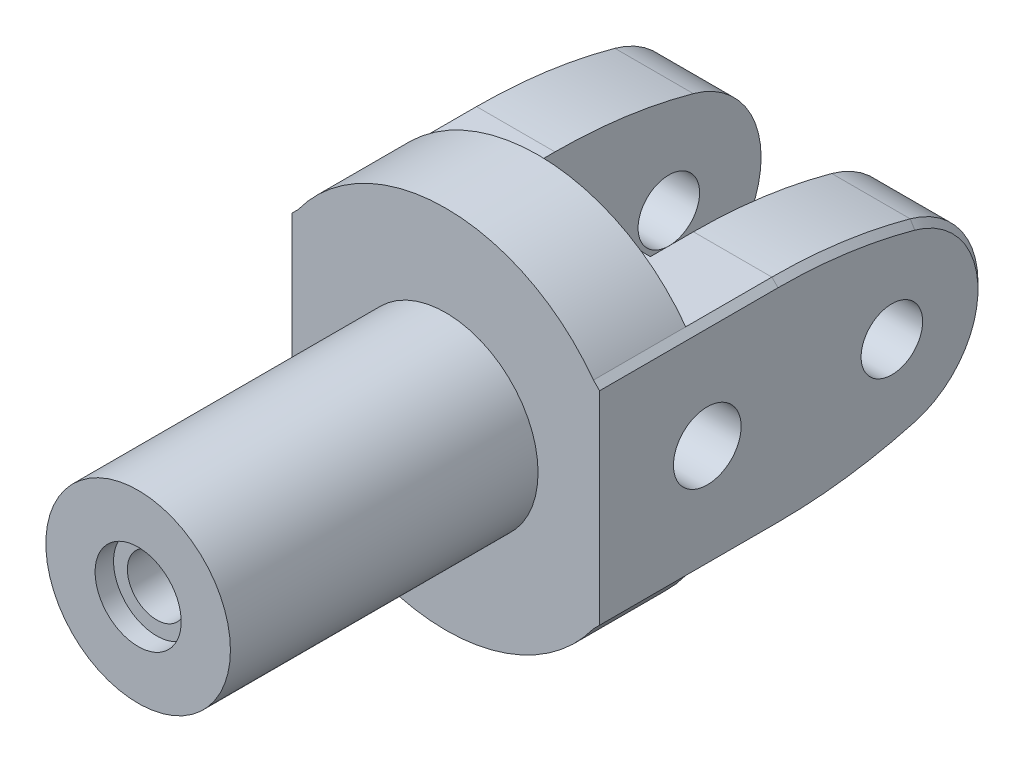
ISO-10303-21;
HEADER;
FILE_DESCRIPTION(('STEP AP214'),'2;1');
FILE_NAME('part.step','',(''),(''),'','','');
FILE_SCHEMA(('AUTOMOTIVE_DESIGN { 1 0 10303 214 1 1 1 1 }'));
ENDSEC;
DATA;
#1=APPLICATION_CONTEXT('core data for automotive mechanical design processes');
#2=APPLICATION_PROTOCOL_DEFINITION('international standard','automotive_design',2000,#1);
#3=PRODUCT_CONTEXT('',#1,'mechanical');
#4=PRODUCT('Part','Part','',(#3));
#5=PRODUCT_RELATED_PRODUCT_CATEGORY('part','',(#4));
#6=PRODUCT_DEFINITION_FORMATION('','',#4);
#7=PRODUCT_DEFINITION_CONTEXT('part definition',#1,'design');
#8=PRODUCT_DEFINITION('design','',#6,#7);
#9=PRODUCT_DEFINITION_SHAPE('','',#8);
#10=(LENGTH_UNIT() NAMED_UNIT(*) SI_UNIT(.MILLI.,.METRE.));
#11=(NAMED_UNIT(*) PLANE_ANGLE_UNIT() SI_UNIT($,.RADIAN.));
#12=(NAMED_UNIT(*) SI_UNIT($,.STERADIAN.) SOLID_ANGLE_UNIT());
#13=UNCERTAINTY_MEASURE_WITH_UNIT(LENGTH_MEASURE(1.E-05),#10,'distance_accuracy_value','');
#14=(GEOMETRIC_REPRESENTATION_CONTEXT(3) GLOBAL_UNCERTAINTY_ASSIGNED_CONTEXT((#13)) GLOBAL_UNIT_ASSIGNED_CONTEXT((#10,
#11,#12)) REPRESENTATION_CONTEXT('',''));
#15=CARTESIAN_POINT('',(0.,0.,0.));
#16=DIRECTION('',(0.,0.,1.));
#17=DIRECTION('',(1.,0.,0.));
#18=AXIS2_PLACEMENT_3D('',#15,#16,#17);
#19=CARTESIAN_POINT('',(0.,0.,0.5));
#20=DIRECTION('',(0.,0.,1.));
#21=DIRECTION('',(1.,0.,0.));
#22=AXIS2_PLACEMENT_3D('',#19,#20,#21);
#23=PLANE('',#22);
#24=DIRECTION('',(-1.,0.,0.));
#25=VECTOR('',#24,1.);
#26=CARTESIAN_POINT('',(5.,-3.50000000000016,0.5));
#27=LINE('',#26,#25);
#28=CARTESIAN_POINT('',(4.8,-3.50000000000016,0.5));
#29=VERTEX_POINT('',#28);
#30=CARTESIAN_POINT('',(-4.8,-3.50000000000016,0.5));
#31=VERTEX_POINT('',#30);
#32=EDGE_CURVE('E305',#29,#31,#27,.T.);
#33=ORIENTED_EDGE('',*,*,#32,.F.);
#34=CARTESIAN_POINT('',(0.,0.,0.5));
#35=DIRECTION('',(0.,0.,1.));
#36=DIRECTION('',(1.,0.,0.));
#37=AXIS2_PLACEMENT_3D('',#34,#35,#36);
#38=CIRCLE('',#37,5.94053869611166);
#39=EDGE_CURVE('E9',#31,#29,#38,.T.);
#40=ORIENTED_EDGE('',*,*,#39,.F.);
#41=EDGE_LOOP('',(#33,#40));
#42=FACE_BOUND('',#41,.T.);
#43=ADVANCED_FACE('F15',(#42),#23,.F.);
#44=CARTESIAN_POINT('',(0.,0.,0.5));
#45=DIRECTION('',(0.,0.,1.));
#46=DIRECTION('',(1.,0.,0.));
#47=AXIS2_PLACEMENT_3D('',#44,#45,#46);
#48=CYLINDRICAL_SURFACE('',#47,5.94053869611166);
#49=CARTESIAN_POINT('',(0.,0.,3.5));
#50=DIRECTION('',(0.,0.,1.));
#51=DIRECTION('',(1.,0.,0.));
#52=AXIS2_PLACEMENT_3D('',#49,#50,#51);
#53=CIRCLE('',#52,5.94053869611166);
#54=CARTESIAN_POINT('',(-4.8,-3.50000000000016,3.5));
#55=VERTEX_POINT('',#54);
#56=CARTESIAN_POINT('',(4.8,-3.50000000000016,3.5));
#57=VERTEX_POINT('',#56);
#58=EDGE_CURVE('E349',#55,#57,#53,.T.);
#59=ORIENTED_EDGE('',*,*,#58,.F.);
#60=DIRECTION('',(0.,0.,-1.));
#61=VECTOR('',#60,1.);
#62=CARTESIAN_POINT('',(-4.8,-3.50000000000016,-2.3));
#63=LINE('',#62,#61);
#64=EDGE_CURVE('E568',#55,#31,#63,.T.);
#65=ORIENTED_EDGE('',*,*,#64,.T.);
#66=ORIENTED_EDGE('',*,*,#39,.T.);
#67=DIRECTION('',(0.,0.,1.));
#68=VECTOR('',#67,1.);
#69=CARTESIAN_POINT('',(4.8,-3.50000000000016,0.5));
#70=LINE('',#69,#68);
#71=EDGE_CURVE('E274',#29,#57,#70,.T.);
#72=ORIENTED_EDGE('',*,*,#71,.T.);
#73=EDGE_LOOP('',(#59,#65,#66,#72));
#74=FACE_BOUND('',#73,.T.);
#75=ADVANCED_FACE('F590',(#74),#48,.T.);
#76=CARTESIAN_POINT('',(0.,0.,0.5));
#77=DIRECTION('',(0.,0.,1.));
#78=DIRECTION('',(1.,0.,0.));
#79=AXIS2_PLACEMENT_3D('',#76,#77,#78);
#80=PLANE('',#79);
#81=DIRECTION('',(-1.,0.,0.));
#82=VECTOR('',#81,1.);
#83=CARTESIAN_POINT('',(5.,3.5,0.5));
#84=LINE('',#83,#82);
#85=CARTESIAN_POINT('',(4.8,3.5,0.5));
#86=VERTEX_POINT('',#85);
#87=CARTESIAN_POINT('',(-4.8,3.5,0.5));
#88=VERTEX_POINT('',#87);
#89=EDGE_CURVE('E439',#86,#88,#84,.T.);
#90=ORIENTED_EDGE('',*,*,#89,.T.);
#91=CARTESIAN_POINT('',(0.,0.,0.5));
#92=DIRECTION('',(0.,0.,1.));
#93=DIRECTION('',(1.,0.,0.));
#94=AXIS2_PLACEMENT_3D('',#91,#92,#93);
#95=CIRCLE('',#94,5.94053869611166);
#96=EDGE_CURVE('E23',#86,#88,#95,.T.);
#97=ORIENTED_EDGE('',*,*,#96,.F.);
#98=EDGE_LOOP('',(#90,#97));
#99=FACE_BOUND('',#98,.T.);
#100=ADVANCED_FACE('F588',(#99),#80,.F.);
#101=CARTESIAN_POINT('',(0.,0.,0.5));
#102=DIRECTION('',(0.,0.,1.));
#103=DIRECTION('',(1.,0.,0.));
#104=AXIS2_PLACEMENT_3D('',#101,#102,#103);
#105=CYLINDRICAL_SURFACE('',#104,5.94053869611166);
#106=CARTESIAN_POINT('',(0.,0.,3.5));
#107=DIRECTION('',(0.,0.,1.));
#108=DIRECTION('',(1.,0.,0.));
#109=AXIS2_PLACEMENT_3D('',#106,#107,#108);
#110=CIRCLE('',#109,5.94053869611166);
#111=CARTESIAN_POINT('',(4.8,3.5,3.5));
#112=VERTEX_POINT('',#111);
#113=CARTESIAN_POINT('',(-4.8,3.5,3.5));
#114=VERTEX_POINT('',#113);
#115=EDGE_CURVE('E373',#112,#114,#110,.T.);
#116=ORIENTED_EDGE('',*,*,#115,.F.);
#117=DIRECTION('',(0.,0.,-1.));
#118=VECTOR('',#117,1.);
#119=CARTESIAN_POINT('',(4.8,3.5,-1.15));
#120=LINE('',#119,#118);
#121=EDGE_CURVE('E545',#112,#86,#120,.T.);
#122=ORIENTED_EDGE('',*,*,#121,.T.);
#123=ORIENTED_EDGE('',*,*,#96,.T.);
#124=DIRECTION('',(0.,0.,1.));
#125=VECTOR('',#124,1.);
#126=CARTESIAN_POINT('',(-4.8,3.5,0.5));
#127=LINE('',#126,#125);
#128=EDGE_CURVE('E553',#88,#114,#127,.T.);
#129=ORIENTED_EDGE('',*,*,#128,.T.);
#130=EDGE_LOOP('',(#116,#122,#123,#129));
#131=FACE_BOUND('',#130,.T.);
#132=ADVANCED_FACE('F577',(#131),#105,.T.);
#133=CARTESIAN_POINT('',(-5.,-3.30000000000016,-2.75));
#134=DIRECTION('',(-0.707106781186547,-0.707106781186548,0.));
#135=DIRECTION('',(-0.707106781186548,0.707106781186547,0.));
#136=AXIS2_PLACEMENT_3D('',#133,#134,#135);
#137=PLANE('',#136);
#138=DIRECTION('',(0.707106781186554,-0.707106781186541,0.));
#139=VECTOR('',#138,1.);
#140=CARTESIAN_POINT('',(-5.,-3.30000000000025,-2.3));
#141=LINE('',#140,#139);
#142=CARTESIAN_POINT('',(-5.,-3.30000000000025,-2.3));
#143=VERTEX_POINT('',#142);
#144=CARTESIAN_POINT('',(-4.8,-3.5,-2.3));
#145=VERTEX_POINT('',#144);
#146=EDGE_CURVE('E565',#143,#145,#141,.T.);
#147=ORIENTED_EDGE('',*,*,#146,.T.);
#148=DIRECTION('',(0.,0.,-1.));
#149=VECTOR('',#148,1.);
#150=CARTESIAN_POINT('',(-4.8,-3.50000000000016,-2.3));
#151=LINE('',#150,#149);
#152=EDGE_CURVE('E311',#31,#145,#151,.T.);
#153=ORIENTED_EDGE('',*,*,#152,.F.);
#154=ORIENTED_EDGE('',*,*,#64,.F.);
#155=DIRECTION('',(0.707106781186548,-0.707106781186547,0.));
#156=VECTOR('',#155,1.);
#157=CARTESIAN_POINT('',(-1.65000000000003,-6.65000000000012,3.5));
#158=LINE('',#157,#156);
#159=CARTESIAN_POINT('',(-5.,-3.30000000000016,3.5));
#160=VERTEX_POINT('',#159);
#161=EDGE_CURVE('E423',#160,#55,#158,.T.);
#162=ORIENTED_EDGE('',*,*,#161,.F.);
#163=DIRECTION('',(0.,0.,1.));
#164=VECTOR('',#163,1.);
#165=CARTESIAN_POINT('',(-5.,-3.30000000000016,3.5));
#166=LINE('',#165,#164);
#167=EDGE_CURVE('E501',#143,#160,#166,.T.);
#168=ORIENTED_EDGE('',*,*,#167,.F.);
#169=EDGE_LOOP('',(#147,#153,#154,#162,#168));
#170=FACE_BOUND('',#169,.T.);
#171=ADVANCED_FACE('F597',(#170),#137,.T.);
#172=CARTESIAN_POINT('',(-4.8,13.4400000000021,-2.3));
#173=DIRECTION('',(1.,0.,0.));
#174=DIRECTION('',(0.,0.,-1.));
#175=AXIS2_PLACEMENT_3D('',#172,#173,#174);
#176=CONICAL_SURFACE('',#175,16.9400000000023,0.785398163397444);
#177=DIRECTION('',(0.707106781186548,-0.681744271100955,-0.187682574633417));
#178=VECTOR('',#177,1.);
#179=CARTESIAN_POINT('',(-5.,-2.69956958393125,-6.74318507890952));
#180=LINE('',#179,#178);
#181=CARTESIAN_POINT('',(-5.,-2.69956958393125,-6.74318507890952));
#182=VERTEX_POINT('',#181);
#183=CARTESIAN_POINT('',(-4.8,-2.89239598278347,-6.79626972740306));
#184=VERTEX_POINT('',#183);
#185=EDGE_CURVE('E562',#182,#184,#180,.T.);
#186=ORIENTED_EDGE('',*,*,#185,.T.);
#187=CARTESIAN_POINT('',(-4.8,13.4400000000021,-2.3));
#188=DIRECTION('',(1.,0.,0.));
#189=DIRECTION('',(0.,0.,-1.));
#190=AXIS2_PLACEMENT_3D('',#187,#188,#189);
#191=CIRCLE('',#190,16.9400000000023);
#192=EDGE_CURVE('E298',#145,#184,#191,.T.);
#193=ORIENTED_EDGE('',*,*,#192,.F.);
#194=ORIENTED_EDGE('',*,*,#146,.F.);
#195=CARTESIAN_POINT('',(-5.,13.4400000000021,-2.3));
#196=DIRECTION('',(-1.,0.,0.));
#197=DIRECTION('',(0.,0.,-1.));
#198=AXIS2_PLACEMENT_3D('',#195,#196,#197);
#199=CIRCLE('',#198,16.7400000000023);
#200=EDGE_CURVE('E497',#182,#143,#199,.T.);
#201=ORIENTED_EDGE('',*,*,#200,.F.);
#202=EDGE_LOOP('',(#186,#193,#194,#201));
#203=FACE_BOUND('',#202,.T.);
#204=ADVANCED_FACE('F613',(#203),#176,.T.);
#205=CARTESIAN_POINT('',(-5.,0.,-6.));
#206=DIRECTION('',(1.,0.,0.));
#207=DIRECTION('',(0.,0.,-1.));
#208=AXIS2_PLACEMENT_3D('',#205,#206,#207);
#209=CONICAL_SURFACE('',#208,2.8,0.785398163397448);
#210=DIRECTION('',(0.707106781186554,0.681744271100951,-0.187682574633406));
#211=VECTOR('',#210,1.);
#212=CARTESIAN_POINT('',(-5.,2.69956958393149,-6.74318507890959));
#213=LINE('',#212,#211);
#214=CARTESIAN_POINT('',(-5.,2.69956958393149,-6.74318507890959));
#215=VERTEX_POINT('',#214);
#216=CARTESIAN_POINT('',(-4.8,2.89239598278372,-6.79626972740313));
#217=VERTEX_POINT('',#216);
#218=EDGE_CURVE('E559',#215,#217,#213,.T.);
#219=ORIENTED_EDGE('',*,*,#218,.T.);
#220=CARTESIAN_POINT('',(-4.8,0.,-6.));
#221=DIRECTION('',(1.,0.,0.));
#222=DIRECTION('',(0.,0.,-1.));
#223=AXIS2_PLACEMENT_3D('',#220,#221,#222);
#224=CIRCLE('',#223,3.);
#225=EDGE_CURVE('E361',#184,#217,#224,.T.);
#226=ORIENTED_EDGE('',*,*,#225,.F.);
#227=ORIENTED_EDGE('',*,*,#185,.F.);
#228=CARTESIAN_POINT('',(-5.,0.,-6.));
#229=DIRECTION('',(-1.,0.,0.));
#230=DIRECTION('',(0.,0.,-1.));
#231=AXIS2_PLACEMENT_3D('',#228,#229,#230);
#232=CIRCLE('',#231,2.8);
#233=EDGE_CURVE('E339',#215,#182,#232,.T.);
#234=ORIENTED_EDGE('',*,*,#233,.F.);
#235=EDGE_LOOP('',(#219,#226,#227,#234));
#236=FACE_BOUND('',#235,.T.);
#237=ADVANCED_FACE('F654',(#236),#209,.T.);
#238=CARTESIAN_POINT('',(-5.,-13.440000000003,-2.3));
#239=DIRECTION('',(1.,0.,0.));
#240=DIRECTION('',(0.,0.,-1.));
#241=AXIS2_PLACEMENT_3D('',#238,#239,#240);
#242=CONICAL_SURFACE('',#241,16.7400000000033,0.785398163397444);
#243=DIRECTION('',(0.707106781186548,0.707106781186547,0.));
#244=VECTOR('',#243,1.);
#245=CARTESIAN_POINT('',(-5.,3.3,-2.3));
#246=LINE('',#245,#244);
#247=CARTESIAN_POINT('',(-5.,3.3,-2.3));
#248=VERTEX_POINT('',#247);
#249=CARTESIAN_POINT('',(-4.8,3.5,-2.3));
#250=VERTEX_POINT('',#249);
#251=EDGE_CURVE('E556',#248,#250,#246,.T.);
#252=ORIENTED_EDGE('',*,*,#251,.T.);
#253=CARTESIAN_POINT('',(-4.8,-13.440000000003,-2.3));
#254=DIRECTION('',(1.,0.,0.));
#255=DIRECTION('',(0.,0.,-1.));
#256=AXIS2_PLACEMENT_3D('',#253,#254,#255);
#257=CIRCLE('',#256,16.9400000000032);
#258=EDGE_CURVE('E385',#217,#250,#257,.T.);
#259=ORIENTED_EDGE('',*,*,#258,.F.);
#260=ORIENTED_EDGE('',*,*,#218,.F.);
#261=CARTESIAN_POINT('',(-5.,-13.440000000003,-2.3));
#262=DIRECTION('',(-1.,0.,0.));
#263=DIRECTION('',(0.,0.,-1.));
#264=AXIS2_PLACEMENT_3D('',#261,#262,#263);
#265=CIRCLE('',#264,16.7400000000032);
#266=EDGE_CURVE('E344',#248,#215,#265,.T.);
#267=ORIENTED_EDGE('',*,*,#266,.F.);
#268=EDGE_LOOP('',(#252,#259,#260,#267));
#269=FACE_BOUND('',#268,.T.);
#270=ADVANCED_FACE('F664',(#269),#242,.T.);
#271=CARTESIAN_POINT('',(-5.,3.3,-2.75));
#272=DIRECTION('',(-0.707106781186547,0.707106781186548,0.));
#273=DIRECTION('',(0.,0.,1.));
#274=AXIS2_PLACEMENT_3D('',#271,#272,#273);
#275=PLANE('',#274);
#276=DIRECTION('',(-0.707106781186548,-0.707106781186547,0.));
#277=VECTOR('',#276,1.);
#278=CARTESIAN_POINT('',(-1.65000000000003,6.65,3.5));
#279=LINE('',#278,#277);
#280=CARTESIAN_POINT('',(-5.,3.3,3.5));
#281=VERTEX_POINT('',#280);
#282=EDGE_CURVE('E490',#114,#281,#279,.T.);
#283=ORIENTED_EDGE('',*,*,#282,.F.);
#284=ORIENTED_EDGE('',*,*,#128,.F.);
#285=DIRECTION('',(0.,0.,1.));
#286=VECTOR('',#285,1.);
#287=CARTESIAN_POINT('',(-4.8,3.5,3.5));
#288=LINE('',#287,#286);
#289=EDGE_CURVE('E418',#250,#88,#288,.T.);
#290=ORIENTED_EDGE('',*,*,#289,.F.);
#291=ORIENTED_EDGE('',*,*,#251,.F.);
#292=DIRECTION('',(0.,0.,-1.));
#293=VECTOR('',#292,1.);
#294=CARTESIAN_POINT('',(-5.,3.3,-2.3));
#295=LINE('',#294,#293);
#296=EDGE_CURVE('E511',#281,#248,#295,.T.);
#297=ORIENTED_EDGE('',*,*,#296,.F.);
#298=EDGE_LOOP('',(#283,#284,#290,#291,#297));
#299=FACE_BOUND('',#298,.T.);
#300=ADVANCED_FACE('F583',(#299),#275,.T.);
#301=CARTESIAN_POINT('',(4.8,-3.50000000000016,1.75));
#302=DIRECTION('',(-0.707106781186548,0.707106781186547,0.));
#303=DIRECTION('',(0.,0.,1.));
#304=AXIS2_PLACEMENT_3D('',#301,#302,#303);
#305=PLANE('',#304);
#306=DIRECTION('',(0.707106781186547,0.707106781186548,0.));
#307=VECTOR('',#306,1.);
#308=CARTESIAN_POINT('',(4.8,-3.50000000000025,-2.3));
#309=LINE('',#308,#307);
#310=CARTESIAN_POINT('',(4.8,-3.5,-2.3));
#311=VERTEX_POINT('',#310);
#312=CARTESIAN_POINT('',(5.,-3.30000000000025,-2.3));
#313=VERTEX_POINT('',#312);
#314=EDGE_CURVE('E263',#311,#313,#309,.T.);
#315=ORIENTED_EDGE('',*,*,#314,.T.);
#316=DIRECTION('',(0.,0.,-1.));
#317=VECTOR('',#316,1.);
#318=CARTESIAN_POINT('',(5.,-3.30000000000016,-2.75));
#319=LINE('',#318,#317);
#320=CARTESIAN_POINT('',(5.,-3.30000000000016,3.5));
#321=VERTEX_POINT('',#320);
#322=EDGE_CURVE('E323',#321,#313,#319,.T.);
#323=ORIENTED_EDGE('',*,*,#322,.F.);
#324=DIRECTION('',(0.707106781186547,0.707106781186548,0.));
#325=VECTOR('',#324,1.);
#326=CARTESIAN_POINT('',(6.65,-1.65000000000011,3.5));
#327=LINE('',#326,#325);
#328=EDGE_CURVE('E345',#57,#321,#327,.T.);
#329=ORIENTED_EDGE('',*,*,#328,.F.);
#330=ORIENTED_EDGE('',*,*,#71,.F.);
#331=DIRECTION('',(0.,0.,1.));
#332=VECTOR('',#331,1.);
#333=CARTESIAN_POINT('',(4.8,-3.50000000000016,1.75));
#334=LINE('',#333,#332);
#335=EDGE_CURVE('E293',#311,#29,#334,.T.);
#336=ORIENTED_EDGE('',*,*,#335,.F.);
#337=EDGE_LOOP('',(#315,#323,#329,#330,#336));
#338=FACE_BOUND('',#337,.T.);
#339=ADVANCED_FACE('F301',(#338),#305,.F.);
#340=CARTESIAN_POINT('',(5.,13.4400000000021,-2.3));
#341=DIRECTION('',(-1.,0.,0.));
#342=DIRECTION('',(0.,0.,1.));
#343=AXIS2_PLACEMENT_3D('',#340,#341,#342);
#344=CONICAL_SURFACE('',#343,16.7400000000023,0.785398163397455);
#345=DIRECTION('',(0.707106781186548,0.681744271100955,0.187682574633418));
#346=VECTOR('',#345,1.);
#347=CARTESIAN_POINT('',(4.8,-2.89239598278347,-6.79626972740306));
#348=LINE('',#347,#346);
#349=CARTESIAN_POINT('',(4.8,-2.89239598278347,-6.79626972740306));
#350=VERTEX_POINT('',#349);
#351=CARTESIAN_POINT('',(5.,-2.69956958393125,-6.74318507890952));
#352=VERTEX_POINT('',#351);
#353=EDGE_CURVE('E275',#350,#352,#348,.T.);
#354=ORIENTED_EDGE('',*,*,#353,.T.);
#355=CARTESIAN_POINT('',(5.,13.4400000000021,-2.3));
#356=DIRECTION('',(1.,0.,0.));
#357=DIRECTION('',(0.,0.,-1.));
#358=AXIS2_PLACEMENT_3D('',#355,#356,#357);
#359=CIRCLE('',#358,16.7400000000023);
#360=EDGE_CURVE('E269',#313,#352,#359,.T.);
#361=ORIENTED_EDGE('',*,*,#360,.F.);
#362=ORIENTED_EDGE('',*,*,#314,.F.);
#363=CARTESIAN_POINT('',(4.8,13.4400000000021,-2.3));
#364=DIRECTION('',(-1.,0.,0.));
#365=DIRECTION('',(0.,0.,-1.));
#366=AXIS2_PLACEMENT_3D('',#363,#364,#365);
#367=CIRCLE('',#366,16.9400000000023);
#368=EDGE_CURVE('E266',#350,#311,#367,.T.);
#369=ORIENTED_EDGE('',*,*,#368,.F.);
#370=EDGE_LOOP('',(#354,#361,#362,#369));
#371=FACE_BOUND('',#370,.T.);
#372=ADVANCED_FACE('F265',(#371),#344,.T.);
#373=CARTESIAN_POINT('',(4.8,0.,-6.));
#374=DIRECTION('',(-1.,0.,0.));
#375=DIRECTION('',(0.,0.,1.));
#376=AXIS2_PLACEMENT_3D('',#373,#374,#375);
#377=CONICAL_SURFACE('',#376,3.,0.785398163397448);
#378=DIRECTION('',(0.707106781186558,-0.681744271100947,0.187682574633406));
#379=VECTOR('',#378,1.);
#380=CARTESIAN_POINT('',(4.8,2.89239598278372,-6.79626972740313));
#381=LINE('',#380,#379);
#382=CARTESIAN_POINT('',(4.8,2.89239598278372,-6.79626972740313));
#383=VERTEX_POINT('',#382);
#384=CARTESIAN_POINT('',(5.,2.6995695839315,-6.7431850789096));
#385=VERTEX_POINT('',#384);
#386=EDGE_CURVE('E388',#383,#385,#381,.T.);
#387=ORIENTED_EDGE('',*,*,#386,.T.);
#388=CARTESIAN_POINT('',(5.,0.,-6.));
#389=DIRECTION('',(1.,0.,0.));
#390=DIRECTION('',(0.,0.,-1.));
#391=AXIS2_PLACEMENT_3D('',#388,#389,#390);
#392=CIRCLE('',#391,2.8);
#393=EDGE_CURVE('E454',#352,#385,#392,.T.);
#394=ORIENTED_EDGE('',*,*,#393,.F.);
#395=ORIENTED_EDGE('',*,*,#353,.F.);
#396=CARTESIAN_POINT('',(4.8,0.,-6.));
#397=DIRECTION('',(-1.,0.,0.));
#398=DIRECTION('',(0.,0.,-1.));
#399=AXIS2_PLACEMENT_3D('',#396,#397,#398);
#400=CIRCLE('',#399,3.);
#401=EDGE_CURVE('E431',#383,#350,#400,.T.);
#402=ORIENTED_EDGE('',*,*,#401,.F.);
#403=EDGE_LOOP('',(#387,#394,#395,#402));
#404=FACE_BOUND('',#403,.T.);
#405=ADVANCED_FACE('F638',(#404),#377,.T.);
#406=CARTESIAN_POINT('',(4.8,-13.440000000003,-2.3));
#407=DIRECTION('',(-1.,0.,0.));
#408=DIRECTION('',(0.,0.,1.));
#409=AXIS2_PLACEMENT_3D('',#406,#407,#408);
#410=CONICAL_SURFACE('',#409,16.9400000000032,0.785398163397446);
#411=DIRECTION('',(0.707106781186547,-0.707106781186548,0.));
#412=VECTOR('',#411,1.);
#413=CARTESIAN_POINT('',(4.8,3.5,-2.3));
#414=LINE('',#413,#412);
#415=CARTESIAN_POINT('',(4.8,3.5,-2.3));
#416=VERTEX_POINT('',#415);
#417=CARTESIAN_POINT('',(5.,3.3,-2.3));
#418=VERTEX_POINT('',#417);
#419=EDGE_CURVE('E542',#416,#418,#414,.T.);
#420=ORIENTED_EDGE('',*,*,#419,.T.);
#421=CARTESIAN_POINT('',(5.,-13.440000000003,-2.3));
#422=DIRECTION('',(1.,0.,0.));
#423=DIRECTION('',(0.,0.,-1.));
#424=AXIS2_PLACEMENT_3D('',#421,#422,#423);
#425=CIRCLE('',#424,16.7400000000033);
#426=EDGE_CURVE('E449',#385,#418,#425,.T.);
#427=ORIENTED_EDGE('',*,*,#426,.F.);
#428=ORIENTED_EDGE('',*,*,#386,.F.);
#429=CARTESIAN_POINT('',(4.8,-13.440000000003,-2.3));
#430=DIRECTION('',(-1.,0.,0.));
#431=DIRECTION('',(0.,0.,-1.));
#432=AXIS2_PLACEMENT_3D('',#429,#430,#431);
#433=CIRCLE('',#432,16.9400000000032);
#434=EDGE_CURVE('E448',#416,#383,#433,.T.);
#435=ORIENTED_EDGE('',*,*,#434,.F.);
#436=EDGE_LOOP('',(#420,#427,#428,#435));
#437=FACE_BOUND('',#436,.T.);
#438=ADVANCED_FACE('F713',(#437),#410,.T.);
#439=CARTESIAN_POINT('',(4.8,3.5,-1.15));
#440=DIRECTION('',(-0.707106781186548,-0.707106781186547,0.));
#441=DIRECTION('',(-0.707106781186547,0.707106781186548,0.));
#442=AXIS2_PLACEMENT_3D('',#439,#440,#441);
#443=PLANE('',#442);
#444=DIRECTION('',(-0.707106781186547,0.707106781186548,0.));
#445=VECTOR('',#444,1.);
#446=CARTESIAN_POINT('',(6.65,1.64999999999995,3.5));
#447=LINE('',#446,#445);
#448=CARTESIAN_POINT('',(5.,3.3,3.5));
#449=VERTEX_POINT('',#448);
#450=EDGE_CURVE('E369',#449,#112,#447,.T.);
#451=ORIENTED_EDGE('',*,*,#450,.F.);
#452=DIRECTION('',(0.,0.,1.));
#453=VECTOR('',#452,1.);
#454=CARTESIAN_POINT('',(5.,3.3,-2.75));
#455=LINE('',#454,#453);
#456=EDGE_CURVE('E453',#418,#449,#455,.T.);
#457=ORIENTED_EDGE('',*,*,#456,.F.);
#458=ORIENTED_EDGE('',*,*,#419,.F.);
#459=DIRECTION('',(0.,0.,-1.));
#460=VECTOR('',#459,1.);
#461=CARTESIAN_POINT('',(4.8,3.5,-1.15));
#462=LINE('',#461,#460);
#463=EDGE_CURVE('E443',#86,#416,#462,.T.);
#464=ORIENTED_EDGE('',*,*,#463,.F.);
#465=ORIENTED_EDGE('',*,*,#121,.F.);
#466=EDGE_LOOP('',(#451,#457,#458,#464,#465));
#467=FACE_BOUND('',#466,.T.);
#468=ADVANCED_FACE('F711',(#467),#443,.F.);
#469=CARTESIAN_POINT('',(0.,0.,13.5));
#470=DIRECTION('',(0.,0.,-1.));
#471=DIRECTION('',(-1.,0.,0.));
#472=AXIS2_PLACEMENT_3D('',#469,#470,#471);
#473=CYLINDRICAL_SURFACE('',#472,1.4);
#474=CARTESIAN_POINT('',(0.,0.,13.5));
#475=DIRECTION('',(0.,0.,-1.));
#476=DIRECTION('',(-1.,0.,0.));
#477=AXIS2_PLACEMENT_3D('',#474,#475,#476);
#478=CIRCLE('',#477,1.4);
#479=CARTESIAN_POINT('',(-1.4,0.,13.5));
#480=VERTEX_POINT('',#479);
#481=EDGE_CURVE('E353',#480,#480,#478,.T.);
#482=ORIENTED_EDGE('',*,*,#481,.F.);
#483=EDGE_LOOP('',(#482));
#484=FACE_BOUND('',#483,.T.);
#485=CARTESIAN_POINT('',(0.,0.,12.9));
#486=DIRECTION('',(0.,0.,-1.));
#487=DIRECTION('',(-1.,0.,0.));
#488=AXIS2_PLACEMENT_3D('',#485,#486,#487);
#489=CIRCLE('',#488,1.4);
#490=CARTESIAN_POINT('',(-1.4,0.,12.9));
#491=VERTEX_POINT('',#490);
#492=EDGE_CURVE('E33',#491,#491,#489,.T.);
#493=ORIENTED_EDGE('',*,*,#492,.T.);
#494=EDGE_LOOP('',(#493));
#495=FACE_BOUND('',#494,.T.);
#496=ADVANCED_FACE('F707',(#484,#495),#473,.F.);
#497=CARTESIAN_POINT('',(1.4,0.,12.9));
#498=DIRECTION('',(0.,0.,1.));
#499=DIRECTION('',(1.,0.,0.));
#500=AXIS2_PLACEMENT_3D('',#497,#498,#499);
#501=PLANE('',#500);
#502=ORIENTED_EDGE('',*,*,#492,.F.);
#503=EDGE_LOOP('',(#502));
#504=FACE_BOUND('',#503,.T.);
#505=CARTESIAN_POINT('',(0.,0.,12.9));
#506=DIRECTION('',(0.,0.,-1.));
#507=DIRECTION('',(-1.,0.,0.));
#508=AXIS2_PLACEMENT_3D('',#505,#506,#507);
#509=CIRCLE('',#508,0.95);
#510=CARTESIAN_POINT('',(-0.95,0.,12.9));
#511=VERTEX_POINT('',#510);
#512=EDGE_CURVE('E40',#511,#511,#509,.T.);
#513=ORIENTED_EDGE('',*,*,#512,.T.);
#514=EDGE_LOOP('',(#513));
#515=FACE_BOUND('',#514,.T.);
#516=ADVANCED_FACE('F703',(#504,#515),#501,.T.);
#517=CARTESIAN_POINT('',(0.,0.,13.5));
#518=DIRECTION('',(0.,0.,-1.));
#519=DIRECTION('',(-1.,0.,0.));
#520=AXIS2_PLACEMENT_3D('',#517,#518,#519);
#521=CYLINDRICAL_SURFACE('',#520,0.95);
#522=ORIENTED_EDGE('',*,*,#512,.F.);
#523=EDGE_LOOP('',(#522));
#524=FACE_BOUND('',#523,.T.);
#525=CARTESIAN_POINT('',(0.,0.,5.5));
#526=DIRECTION('',(0.,0.,-1.));
#527=DIRECTION('',(-1.,0.,0.));
#528=AXIS2_PLACEMENT_3D('',#525,#526,#527);
#529=CIRCLE('',#528,0.95);
#530=CARTESIAN_POINT('',(-0.95,0.,5.5));
#531=VERTEX_POINT('',#530);
#532=EDGE_CURVE('E356',#531,#531,#529,.T.);
#533=ORIENTED_EDGE('',*,*,#532,.T.);
#534=EDGE_LOOP('',(#533));
#535=FACE_BOUND('',#534,.T.);
#536=ADVANCED_FACE('F700',(#524,#535),#521,.F.);
#537=CARTESIAN_POINT('',(0.,0.,5.5));
#538=DIRECTION('',(0.,0.,1.));
#539=DIRECTION('',(1.,0.,0.));
#540=AXIS2_PLACEMENT_3D('',#537,#538,#539);
#541=CONICAL_SURFACE('',#540,0.95,1.02974425867665);
#542=ORIENTED_EDGE('',*,*,#532,.F.);
#543=EDGE_LOOP('',(#542));
#544=FACE_BOUND('',#543,.T.);
#545=CARTESIAN_POINT('',(0.,0.,4.92918241192382));
#546=VERTEX_POINT('',#545);
#547=VERTEX_LOOP('',#546);
#548=FACE_BOUND('',#547,.T.);
#549=ADVANCED_FACE('F698',(#544,#548),#541,.F.);
#550=CARTESIAN_POINT('',(0.,0.,13.5));
#551=DIRECTION('',(0.,0.,1.));
#552=DIRECTION('',(1.,0.,0.));
#553=AXIS2_PLACEMENT_3D('',#550,#551,#552);
#554=PLANE('',#553);
#555=CARTESIAN_POINT('',(0.,0.,13.5));
#556=DIRECTION('',(0.,0.,1.));
#557=DIRECTION('',(1.,0.,0.));
#558=AXIS2_PLACEMENT_3D('',#555,#556,#557);
#559=CIRCLE('',#558,3.);
#560=CARTESIAN_POINT('',(3.,0.,13.5));
#561=VERTEX_POINT('',#560);
#562=EDGE_CURVE('E357',#561,#561,#559,.T.);
#563=ORIENTED_EDGE('',*,*,#562,.T.);
#564=EDGE_LOOP('',(#563));
#565=FACE_BOUND('',#564,.T.);
#566=ORIENTED_EDGE('',*,*,#481,.T.);
#567=EDGE_LOOP('',(#566));
#568=FACE_BOUND('',#567,.T.);
#569=ADVANCED_FACE('F694',(#565,#568),#554,.T.);
#570=CARTESIAN_POINT('',(0.,0.,13.5));
#571=DIRECTION('',(0.,0.,-1.));
#572=DIRECTION('',(-1.,0.,0.));
#573=AXIS2_PLACEMENT_3D('',#570,#571,#572);
#574=CYLINDRICAL_SURFACE('',#573,3.);
#575=CARTESIAN_POINT('',(0.,0.,3.5));
#576=DIRECTION('',(0.,0.,1.));
#577=DIRECTION('',(1.,0.,0.));
#578=AXIS2_PLACEMENT_3D('',#575,#576,#577);
#579=CIRCLE('',#578,3.);
#580=CARTESIAN_POINT('',(3.,0.,3.5));
#581=VERTEX_POINT('',#580);
#582=EDGE_CURVE('E427',#581,#581,#579,.T.);
#583=ORIENTED_EDGE('',*,*,#582,.T.);
#584=EDGE_LOOP('',(#583));
#585=FACE_BOUND('',#584,.T.);
#586=ORIENTED_EDGE('',*,*,#562,.F.);
#587=EDGE_LOOP('',(#586));
#588=FACE_BOUND('',#587,.T.);
#589=ADVANCED_FACE('F690',(#585,#588),#574,.T.);
#590=CARTESIAN_POINT('',(-2.25,0.5,-2.3));
#591=DIRECTION('',(0.,-0.422618261740699,0.90630778703665));
#592=DIRECTION('',(-1.,0.,0.));
#593=AXIS2_PLACEMENT_3D('',#590,#591,#592);
#594=PLANE('',#593);
#595=DIRECTION('',(0.,-0.90630778703665,-0.422618261740699));
#596=VECTOR('',#595,1.);
#597=CARTESIAN_POINT('',(-2.25,0.5,-2.3));
#598=LINE('',#597,#596);
#599=CARTESIAN_POINT('',(-2.25,3.5,-0.901077025535004));
#600=VERTEX_POINT('',#599);
#601=CARTESIAN_POINT('',(-2.25,0.5,-2.3));
#602=VERTEX_POINT('',#601);
#603=EDGE_CURVE('E403',#600,#602,#598,.T.);
#604=ORIENTED_EDGE('',*,*,#603,.F.);
#605=DIRECTION('',(-1.,0.,0.));
#606=VECTOR('',#605,1.);
#607=CARTESIAN_POINT('',(5.,3.5,-0.901077025535004));
#608=LINE('',#607,#606);
#609=CARTESIAN_POINT('',(2.25,3.5,-0.901077025535004));
#610=VERTEX_POINT('',#609);
#611=EDGE_CURVE('E419',#610,#600,#608,.T.);
#612=ORIENTED_EDGE('',*,*,#611,.F.);
#613=DIRECTION('',(0.,0.90630778703665,0.422618261740699));
#614=VECTOR('',#613,1.);
#615=CARTESIAN_POINT('',(2.25,-0.0830569021234106,-2.57188389860027));
#616=LINE('',#615,#614);
#617=CARTESIAN_POINT('',(2.25,0.5,-2.3));
#618=VERTEX_POINT('',#617);
#619=EDGE_CURVE('E413',#618,#610,#616,.T.);
#620=ORIENTED_EDGE('',*,*,#619,.F.);
#621=DIRECTION('',(1.,0.,0.));
#622=VECTOR('',#621,1.);
#623=CARTESIAN_POINT('',(-2.25,0.5,-2.3));
#624=LINE('',#623,#622);
#625=EDGE_CURVE('E479',#602,#618,#624,.T.);
#626=ORIENTED_EDGE('',*,*,#625,.F.);
#627=EDGE_LOOP('',(#604,#612,#620,#626));
#628=FACE_BOUND('',#627,.T.);
#629=ADVANCED_FACE('F687',(#628),#594,.F.);
#630=CARTESIAN_POINT('',(5.,-3.50000000000016,-0.901077025534929));
#631=DIRECTION('',(0.,0.422618261740699,0.90630778703665));
#632=DIRECTION('',(1.,0.,0.));
#633=AXIS2_PLACEMENT_3D('',#630,#631,#632);
#634=PLANE('',#633);
#635=DIRECTION('',(0.,-0.90630778703665,0.422618261740699));
#636=VECTOR('',#635,1.);
#637=CARTESIAN_POINT('',(-2.25,-3.50000000000016,-0.901077025534929));
#638=LINE('',#637,#636);
#639=CARTESIAN_POINT('',(-2.25,-0.5,-2.3));
#640=VERTEX_POINT('',#639);
#641=CARTESIAN_POINT('',(-2.25,-3.50000000000016,-0.901077025534929));
#642=VERTEX_POINT('',#641);
#643=EDGE_CURVE('E407',#640,#642,#638,.T.);
#644=ORIENTED_EDGE('',*,*,#643,.F.);
#645=DIRECTION('',(-1.,0.,0.));
#646=VECTOR('',#645,1.);
#647=CARTESIAN_POINT('',(-2.25,-0.5,-2.3));
#648=LINE('',#647,#646);
#649=CARTESIAN_POINT('',(2.25,-0.5,-2.3));
#650=VERTEX_POINT('',#649);
#651=EDGE_CURVE('E521',#650,#640,#648,.T.);
#652=ORIENTED_EDGE('',*,*,#651,.F.);
#653=DIRECTION('',(0.,0.90630778703665,-0.422618261740699));
#654=VECTOR('',#653,1.);
#655=CARTESIAN_POINT('',(2.25,0.0830569021234058,-2.57188389860027));
#656=LINE('',#655,#654);
#657=CARTESIAN_POINT('',(2.25,-3.50000000000016,-0.901077025534929));
#658=VERTEX_POINT('',#657);
#659=EDGE_CURVE('E406',#658,#650,#656,.T.);
#660=ORIENTED_EDGE('',*,*,#659,.F.);
#661=DIRECTION('',(1.,0.,0.));
#662=VECTOR('',#661,1.);
#663=CARTESIAN_POINT('',(5.,-3.50000000000016,-0.901077025534929));
#664=LINE('',#663,#662);
#665=EDGE_CURVE('E329',#642,#658,#664,.T.);
#666=ORIENTED_EDGE('',*,*,#665,.F.);
#667=EDGE_LOOP('',(#644,#652,#660,#666));
#668=FACE_BOUND('',#667,.T.);
#669=ADVANCED_FACE('F626',(#668),#634,.F.);
#670=CARTESIAN_POINT('',(2.25,0.,-2.75));
#671=DIRECTION('',(1.,0.,0.));
#672=DIRECTION('',(0.,1.,0.));
#673=AXIS2_PLACEMENT_3D('',#670,#671,#672);
#674=PLANE('',#673);
#675=CARTESIAN_POINT('',(2.25,13.4400000000021,-2.3));
#676=DIRECTION('',(1.,0.,0.));
#677=DIRECTION('',(0.,0.,-1.));
#678=AXIS2_PLACEMENT_3D('',#675,#676,#677);
#679=CIRCLE('',#678,16.9400000000023);
#680=CARTESIAN_POINT('',(2.25,-3.5,-2.3));
#681=VERTEX_POINT('',#680);
#682=CARTESIAN_POINT('',(2.25,-2.89239598278347,-6.79626972740306));
#683=VERTEX_POINT('',#682);
#684=EDGE_CURVE('E287',#681,#683,#679,.T.);
#685=ORIENTED_EDGE('',*,*,#684,.F.);
#686=DIRECTION('',(0.,0.,-1.));
#687=VECTOR('',#686,1.);
#688=CARTESIAN_POINT('',(2.25,-3.50000000000016,-2.75));
#689=LINE('',#688,#687);
#690=EDGE_CURVE('E296',#658,#681,#689,.T.);
#691=ORIENTED_EDGE('',*,*,#690,.F.);
#692=ORIENTED_EDGE('',*,*,#659,.T.);
#693=DIRECTION('',(0.,1.,0.));
#694=VECTOR('',#693,1.);
#695=CARTESIAN_POINT('',(2.25,1.74999999999997,-2.3));
#696=LINE('',#695,#694);
#697=EDGE_CURVE('E343',#650,#618,#696,.T.);
#698=ORIENTED_EDGE('',*,*,#697,.T.);
#699=ORIENTED_EDGE('',*,*,#619,.T.);
#700=DIRECTION('',(0.,0.,1.));
#701=VECTOR('',#700,1.);
#702=CARTESIAN_POINT('',(2.25,3.5,-2.75));
#703=LINE('',#702,#701);
#704=CARTESIAN_POINT('',(2.25,3.5,-2.3));
#705=VERTEX_POINT('',#704);
#706=EDGE_CURVE('E466',#705,#610,#703,.T.);
#707=ORIENTED_EDGE('',*,*,#706,.F.);
#708=CARTESIAN_POINT('',(2.25,-13.440000000003,-2.3));
#709=DIRECTION('',(-1.,0.,0.));
#710=DIRECTION('',(0.,0.,-1.));
#711=AXIS2_PLACEMENT_3D('',#708,#709,#710);
#712=CIRCLE('',#711,16.9400000000032);
#713=CARTESIAN_POINT('',(2.25,2.89239598278372,-6.79626972740313));
#714=VERTEX_POINT('',#713);
#715=EDGE_CURVE('E444',#705,#714,#712,.T.);
#716=ORIENTED_EDGE('',*,*,#715,.T.);
#717=CARTESIAN_POINT('',(2.25,0.,-6.));
#718=DIRECTION('',(-1.,0.,0.));
#719=DIRECTION('',(0.,0.,-1.));
#720=AXIS2_PLACEMENT_3D('',#717,#718,#719);
#721=CIRCLE('',#720,3.);
#722=EDGE_CURVE('E435',#714,#683,#721,.T.);
#723=ORIENTED_EDGE('',*,*,#722,.T.);
#724=EDGE_LOOP('',(#685,#691,#692,#698,#699,#707,#716,#723));
#725=FACE_BOUND('',#724,.T.);
#726=CARTESIAN_POINT('',(2.25,0.,-6.));
#727=DIRECTION('',(1.,0.,0.));
#728=DIRECTION('',(0.,0.,-1.));
#729=AXIS2_PLACEMENT_3D('',#726,#727,#728);
#730=CIRCLE('',#729,1.);
#731=CARTESIAN_POINT('',(2.25,0.,-7.));
#732=VERTEX_POINT('',#731);
#733=EDGE_CURVE('E324',#732,#732,#730,.T.);
#734=ORIENTED_EDGE('',*,*,#733,.T.);
#735=EDGE_LOOP('',(#734));
#736=FACE_BOUND('',#735,.T.);
#737=ADVANCED_FACE('F630',(#725,#736),#674,.F.);
#738=CARTESIAN_POINT('',(-2.25,0.,-2.75));
#739=DIRECTION('',(1.,0.,0.));
#740=DIRECTION('',(0.,1.,0.));
#741=AXIS2_PLACEMENT_3D('',#738,#739,#740);
#742=PLANE('',#741);
#743=DIRECTION('',(0.,1.,0.));
#744=VECTOR('',#743,1.);
#745=CARTESIAN_POINT('',(-2.25,1.74999999999997,-2.3));
#746=LINE('',#745,#744);
#747=EDGE_CURVE('E525',#640,#602,#746,.T.);
#748=ORIENTED_EDGE('',*,*,#747,.F.);
#749=ORIENTED_EDGE('',*,*,#643,.T.);
#750=DIRECTION('',(0.,0.,1.));
#751=VECTOR('',#750,1.);
#752=CARTESIAN_POINT('',(-2.25,-3.50000000000016,1.75));
#753=LINE('',#752,#751);
#754=CARTESIAN_POINT('',(-2.25,-3.5,-2.3));
#755=VERTEX_POINT('',#754);
#756=EDGE_CURVE('E332',#755,#642,#753,.T.);
#757=ORIENTED_EDGE('',*,*,#756,.F.);
#758=CARTESIAN_POINT('',(-2.25,13.4400000000021,-2.3));
#759=DIRECTION('',(1.,0.,0.));
#760=DIRECTION('',(0.,0.,-1.));
#761=AXIS2_PLACEMENT_3D('',#758,#759,#760);
#762=CIRCLE('',#761,16.9400000000023);
#763=CARTESIAN_POINT('',(-2.25,-2.89239598278347,-6.79626972740306));
#764=VERTEX_POINT('',#763);
#765=EDGE_CURVE('E328',#755,#764,#762,.T.);
#766=ORIENTED_EDGE('',*,*,#765,.T.);
#767=CARTESIAN_POINT('',(-2.25,0.,-6.));
#768=DIRECTION('',(-1.,0.,0.));
#769=DIRECTION('',(0.,0.,-1.));
#770=AXIS2_PLACEMENT_3D('',#767,#768,#769);
#771=CIRCLE('',#770,3.);
#772=CARTESIAN_POINT('',(-2.25,2.89239598278372,-6.79626972740313));
#773=VERTEX_POINT('',#772);
#774=EDGE_CURVE('E379',#773,#764,#771,.T.);
#775=ORIENTED_EDGE('',*,*,#774,.F.);
#776=CARTESIAN_POINT('',(-2.25,-13.440000000003,-2.3));
#777=DIRECTION('',(-1.,0.,0.));
#778=DIRECTION('',(0.,0.,-1.));
#779=AXIS2_PLACEMENT_3D('',#776,#777,#778);
#780=CIRCLE('',#779,16.9400000000032);
#781=CARTESIAN_POINT('',(-2.25,3.5,-2.3));
#782=VERTEX_POINT('',#781);
#783=EDGE_CURVE('E396',#782,#773,#780,.T.);
#784=ORIENTED_EDGE('',*,*,#783,.F.);
#785=DIRECTION('',(0.,0.,-1.));
#786=VECTOR('',#785,1.);
#787=CARTESIAN_POINT('',(-2.25,3.5,-1.15));
#788=LINE('',#787,#786);
#789=EDGE_CURVE('E415',#600,#782,#788,.T.);
#790=ORIENTED_EDGE('',*,*,#789,.F.);
#791=ORIENTED_EDGE('',*,*,#603,.T.);
#792=EDGE_LOOP('',(#748,#749,#757,#766,#775,#784,#790,#791));
#793=FACE_BOUND('',#792,.T.);
#794=CARTESIAN_POINT('',(-2.25,0.,-6.));
#795=DIRECTION('',(1.,0.,0.));
#796=DIRECTION('',(0.,0.,-1.));
#797=AXIS2_PLACEMENT_3D('',#794,#795,#796);
#798=CIRCLE('',#797,1.);
#799=CARTESIAN_POINT('',(-2.25,0.,-7.));
#800=VERTEX_POINT('',#799);
#801=EDGE_CURVE('E402',#800,#800,#798,.T.);
#802=ORIENTED_EDGE('',*,*,#801,.F.);
#803=EDGE_LOOP('',(#802));
#804=FACE_BOUND('',#803,.T.);
#805=ADVANCED_FACE('F622',(#793,#804),#742,.T.);
#806=CARTESIAN_POINT('',(-2.25,1.74999999999997,-2.3));
#807=DIRECTION('',(0.,0.,-1.));
#808=DIRECTION('',(0.,-1.,0.));
#809=AXIS2_PLACEMENT_3D('',#806,#807,#808);
#810=PLANE('',#809);
#811=ORIENTED_EDGE('',*,*,#697,.F.);
#812=ORIENTED_EDGE('',*,*,#651,.T.);
#813=ORIENTED_EDGE('',*,*,#747,.T.);
#814=ORIENTED_EDGE('',*,*,#625,.T.);
#815=EDGE_LOOP('',(#811,#812,#813,#814));
#816=FACE_BOUND('',#815,.T.);
#817=ADVANCED_FACE('F677',(#816),#810,.T.);
#818=CARTESIAN_POINT('',(-5.,0.,-2.75));
#819=DIRECTION('',(1.,0.,0.));
#820=DIRECTION('',(0.,1.,0.));
#821=AXIS2_PLACEMENT_3D('',#818,#819,#820);
#822=PLANE('',#821);
#823=CARTESIAN_POINT('',(-5.,0.,-6.));
#824=DIRECTION('',(1.,0.,0.));
#825=DIRECTION('',(0.,0.,-1.));
#826=AXIS2_PLACEMENT_3D('',#823,#824,#825);
#827=CIRCLE('',#826,1.);
#828=CARTESIAN_POINT('',(-5.,0.,-7.));
#829=VERTEX_POINT('',#828);
#830=EDGE_CURVE('E399',#829,#829,#827,.T.);
#831=ORIENTED_EDGE('',*,*,#830,.T.);
#832=EDGE_LOOP('',(#831));
#833=FACE_BOUND('',#832,.T.);
#834=CARTESIAN_POINT('',(-5.,0.,0.));
#835=DIRECTION('',(1.,0.,0.));
#836=DIRECTION('',(0.,0.,-1.));
#837=AXIS2_PLACEMENT_3D('',#834,#835,#836);
#838=CIRCLE('',#837,1.1);
#839=CARTESIAN_POINT('',(-5.,0.,-1.1));
#840=VERTEX_POINT('',#839);
#841=EDGE_CURVE('E482',#840,#840,#838,.T.);
#842=ORIENTED_EDGE('',*,*,#841,.T.);
#843=EDGE_LOOP('',(#842));
#844=FACE_BOUND('',#843,.T.);
#845=ORIENTED_EDGE('',*,*,#200,.T.);
#846=ORIENTED_EDGE('',*,*,#167,.T.);
#847=DIRECTION('',(0.,1.,0.));
#848=VECTOR('',#847,1.);
#849=CARTESIAN_POINT('',(-5.,0.,3.5));
#850=LINE('',#849,#848);
#851=EDGE_CURVE('E360',#160,#281,#850,.T.);
#852=ORIENTED_EDGE('',*,*,#851,.T.);
#853=ORIENTED_EDGE('',*,*,#296,.T.);
#854=ORIENTED_EDGE('',*,*,#266,.T.);
#855=ORIENTED_EDGE('',*,*,#233,.T.);
#856=EDGE_LOOP('',(#845,#846,#852,#853,#854,#855));
#857=FACE_BOUND('',#856,.T.);
#858=ADVANCED_FACE('F650',(#833,#844,#857),#822,.F.);
#859=CARTESIAN_POINT('',(5.,0.,-2.75));
#860=DIRECTION('',(1.,0.,0.));
#861=DIRECTION('',(0.,1.,0.));
#862=AXIS2_PLACEMENT_3D('',#859,#860,#861);
#863=PLANE('',#862);
#864=CARTESIAN_POINT('',(5.,0.,-6.));
#865=DIRECTION('',(1.,0.,0.));
#866=DIRECTION('',(0.,0.,-1.));
#867=AXIS2_PLACEMENT_3D('',#864,#865,#866);
#868=CIRCLE('',#867,1.);
#869=CARTESIAN_POINT('',(5.,0.,-7.));
#870=VERTEX_POINT('',#869);
#871=EDGE_CURVE('E320',#870,#870,#868,.T.);
#872=ORIENTED_EDGE('',*,*,#871,.F.);
#873=EDGE_LOOP('',(#872));
#874=FACE_BOUND('',#873,.T.);
#875=CARTESIAN_POINT('',(5.,0.,0.));
#876=DIRECTION('',(1.,0.,0.));
#877=DIRECTION('',(0.,0.,-1.));
#878=AXIS2_PLACEMENT_3D('',#875,#876,#877);
#879=CIRCLE('',#878,1.1);
#880=CARTESIAN_POINT('',(5.,0.,-1.1));
#881=VERTEX_POINT('',#880);
#882=EDGE_CURVE('E476',#881,#881,#879,.T.);
#883=ORIENTED_EDGE('',*,*,#882,.F.);
#884=EDGE_LOOP('',(#883));
#885=FACE_BOUND('',#884,.T.);
#886=DIRECTION('',(0.,1.,0.));
#887=VECTOR('',#886,1.);
#888=CARTESIAN_POINT('',(5.,0.,3.5));
#889=LINE('',#888,#887);
#890=EDGE_CURVE('E315',#321,#449,#889,.T.);
#891=ORIENTED_EDGE('',*,*,#890,.F.);
#892=ORIENTED_EDGE('',*,*,#322,.T.);
#893=ORIENTED_EDGE('',*,*,#360,.T.);
#894=ORIENTED_EDGE('',*,*,#393,.T.);
#895=ORIENTED_EDGE('',*,*,#426,.T.);
#896=ORIENTED_EDGE('',*,*,#456,.T.);
#897=EDGE_LOOP('',(#891,#892,#893,#894,#895,#896));
#898=FACE_BOUND('',#897,.T.);
#899=ADVANCED_FACE('F643',(#874,#885,#898),#863,.T.);
#900=CARTESIAN_POINT('',(5.,0.,-6.));
#901=DIRECTION('',(-1.,0.,0.));
#902=DIRECTION('',(0.,0.,1.));
#903=AXIS2_PLACEMENT_3D('',#900,#901,#902);
#904=CYLINDRICAL_SURFACE('',#903,1.);
#905=ORIENTED_EDGE('',*,*,#871,.T.);
#906=EDGE_LOOP('',(#905));
#907=FACE_BOUND('',#906,.T.);
#908=ORIENTED_EDGE('',*,*,#733,.F.);
#909=EDGE_LOOP('',(#908));
#910=FACE_BOUND('',#909,.T.);
#911=ADVANCED_FACE('F675',(#907,#910),#904,.F.);
#912=CARTESIAN_POINT('',(5.,0.,3.5));
#913=DIRECTION('',(0.,0.,1.));
#914=DIRECTION('',(1.,0.,0.));
#915=AXIS2_PLACEMENT_3D('',#912,#913,#914);
#916=PLANE('',#915);
#917=ORIENTED_EDGE('',*,*,#161,.T.);
#918=ORIENTED_EDGE('',*,*,#58,.T.);
#919=ORIENTED_EDGE('',*,*,#328,.T.);
#920=ORIENTED_EDGE('',*,*,#890,.T.);
#921=ORIENTED_EDGE('',*,*,#450,.T.);
#922=ORIENTED_EDGE('',*,*,#115,.T.);
#923=ORIENTED_EDGE('',*,*,#282,.T.);
#924=ORIENTED_EDGE('',*,*,#851,.F.);
#925=EDGE_LOOP('',(#917,#918,#919,#920,#921,#922,#923,#924));
#926=FACE_BOUND('',#925,.T.);
#927=ORIENTED_EDGE('',*,*,#582,.F.);
#928=EDGE_LOOP('',(#927));
#929=FACE_BOUND('',#928,.T.);
#930=ADVANCED_FACE('F646',(#926,#929),#916,.T.);
#931=CARTESIAN_POINT('',(5.,0.,0.));
#932=DIRECTION('',(-1.,0.,0.));
#933=DIRECTION('',(0.,0.,1.));
#934=AXIS2_PLACEMENT_3D('',#931,#932,#933);
#935=CYLINDRICAL_SURFACE('',#934,1.1);
#936=ORIENTED_EDGE('',*,*,#841,.F.);
#937=EDGE_LOOP('',(#936));
#938=FACE_BOUND('',#937,.T.);
#939=ORIENTED_EDGE('',*,*,#882,.T.);
#940=EDGE_LOOP('',(#939));
#941=FACE_BOUND('',#940,.T.);
#942=ADVANCED_FACE('F920',(#938,#941),#935,.F.);
#943=CARTESIAN_POINT('',(5.,3.5,-1.15));
#944=DIRECTION('',(0.,1.,0.));
#945=DIRECTION('',(1.,0.,0.));
#946=AXIS2_PLACEMENT_3D('',#943,#944,#945);
#947=PLANE('',#946);
#948=ORIENTED_EDGE('',*,*,#89,.F.);
#949=ORIENTED_EDGE('',*,*,#463,.T.);
#950=DIRECTION('',(-1.,0.,0.));
#951=VECTOR('',#950,1.);
#952=CARTESIAN_POINT('',(5.,3.5,-2.3));
#953=LINE('',#952,#951);
#954=EDGE_CURVE('E438',#416,#705,#953,.T.);
#955=ORIENTED_EDGE('',*,*,#954,.T.);
#956=ORIENTED_EDGE('',*,*,#706,.T.);
#957=ORIENTED_EDGE('',*,*,#611,.T.);
#958=ORIENTED_EDGE('',*,*,#789,.T.);
#959=DIRECTION('',(-1.,0.,0.));
#960=VECTOR('',#959,1.);
#961=CARTESIAN_POINT('',(5.,3.5,-2.3));
#962=LINE('',#961,#960);
#963=EDGE_CURVE('E392',#782,#250,#962,.T.);
#964=ORIENTED_EDGE('',*,*,#963,.T.);
#965=ORIENTED_EDGE('',*,*,#289,.T.);
#966=EDGE_LOOP('',(#948,#949,#955,#956,#957,#958,#964,#965));
#967=FACE_BOUND('',#966,.T.);
#968=ADVANCED_FACE('F586',(#967),#947,.T.);
#969=CARTESIAN_POINT('',(5.,-13.440000000003,-2.3));
#970=DIRECTION('',(-1.,0.,0.));
#971=DIRECTION('',(0.,0.,1.));
#972=AXIS2_PLACEMENT_3D('',#969,#970,#971);
#973=CYLINDRICAL_SURFACE('',#972,16.9400000000032);
#974=ORIENTED_EDGE('',*,*,#954,.F.);
#975=ORIENTED_EDGE('',*,*,#434,.T.);
#976=DIRECTION('',(-1.,0.,0.));
#977=VECTOR('',#976,1.);
#978=CARTESIAN_POINT('',(5.,2.89239598278372,-6.79626972740313));
#979=LINE('',#978,#977);
#980=EDGE_CURVE('E422',#383,#714,#979,.T.);
#981=ORIENTED_EDGE('',*,*,#980,.T.);
#982=ORIENTED_EDGE('',*,*,#715,.F.);
#983=EDGE_LOOP('',(#974,#975,#981,#982));
#984=FACE_BOUND('',#983,.T.);
#985=ADVANCED_FACE('F940',(#984),#973,.T.);
#986=CARTESIAN_POINT('',(5.,0.,-6.));
#987=DIRECTION('',(-1.,0.,0.));
#988=DIRECTION('',(0.,0.,1.));
#989=AXIS2_PLACEMENT_3D('',#986,#987,#988);
#990=CYLINDRICAL_SURFACE('',#989,3.);
#991=ORIENTED_EDGE('',*,*,#980,.F.);
#992=ORIENTED_EDGE('',*,*,#401,.T.);
#993=DIRECTION('',(-1.,0.,0.));
#994=VECTOR('',#993,1.);
#995=CARTESIAN_POINT('',(5.,-2.89239598278347,-6.79626972740306));
#996=LINE('',#995,#994);
#997=EDGE_CURVE('E285',#350,#683,#996,.T.);
#998=ORIENTED_EDGE('',*,*,#997,.T.);
#999=ORIENTED_EDGE('',*,*,#722,.F.);
#1000=EDGE_LOOP('',(#991,#992,#998,#999));
#1001=FACE_BOUND('',#1000,.T.);
#1002=ADVANCED_FACE('F635',(#1001),#990,.T.);
#1003=CARTESIAN_POINT('',(5.,13.4400000000021,-2.3));
#1004=DIRECTION('',(-1.,0.,0.));
#1005=DIRECTION('',(0.,0.,1.));
#1006=AXIS2_PLACEMENT_3D('',#1003,#1004,#1005);
#1007=CYLINDRICAL_SURFACE('',#1006,16.9400000000023);
#1008=ORIENTED_EDGE('',*,*,#997,.F.);
#1009=ORIENTED_EDGE('',*,*,#368,.T.);
#1010=DIRECTION('',(-1.,0.,0.));
#1011=VECTOR('',#1010,1.);
#1012=CARTESIAN_POINT('',(5.,-3.5,-2.3));
#1013=LINE('',#1012,#1011);
#1014=EDGE_CURVE('E282',#311,#681,#1013,.T.);
#1015=ORIENTED_EDGE('',*,*,#1014,.T.);
#1016=ORIENTED_EDGE('',*,*,#684,.T.);
#1017=EDGE_LOOP('',(#1008,#1009,#1015,#1016));
#1018=FACE_BOUND('',#1017,.T.);
#1019=ADVANCED_FACE('F280',(#1018),#1007,.T.);
#1020=CARTESIAN_POINT('',(5.,0.,-6.));
#1021=DIRECTION('',(-1.,0.,0.));
#1022=DIRECTION('',(0.,0.,1.));
#1023=AXIS2_PLACEMENT_3D('',#1020,#1021,#1022);
#1024=CYLINDRICAL_SURFACE('',#1023,1.);
#1025=ORIENTED_EDGE('',*,*,#801,.T.);
#1026=EDGE_LOOP('',(#1025));
#1027=FACE_BOUND('',#1026,.T.);
#1028=ORIENTED_EDGE('',*,*,#830,.F.);
#1029=EDGE_LOOP('',(#1028));
#1030=FACE_BOUND('',#1029,.T.);
#1031=ADVANCED_FACE('F967',(#1027,#1030),#1024,.F.);
#1032=CARTESIAN_POINT('',(5.,-13.440000000003,-2.3));
#1033=DIRECTION('',(-1.,0.,0.));
#1034=DIRECTION('',(0.,0.,1.));
#1035=AXIS2_PLACEMENT_3D('',#1032,#1033,#1034);
#1036=CYLINDRICAL_SURFACE('',#1035,16.9400000000032);
#1037=DIRECTION('',(-1.,0.,0.));
#1038=VECTOR('',#1037,1.);
#1039=CARTESIAN_POINT('',(5.,2.89239598278372,-6.79626972740313));
#1040=LINE('',#1039,#1038);
#1041=EDGE_CURVE('E365',#773,#217,#1040,.T.);
#1042=ORIENTED_EDGE('',*,*,#1041,.T.);
#1043=ORIENTED_EDGE('',*,*,#258,.T.);
#1044=ORIENTED_EDGE('',*,*,#963,.F.);
#1045=ORIENTED_EDGE('',*,*,#783,.T.);
#1046=EDGE_LOOP('',(#1042,#1043,#1044,#1045));
#1047=FACE_BOUND('',#1046,.T.);
#1048=ADVANCED_FACE('F662',(#1047),#1036,.T.);
#1049=CARTESIAN_POINT('',(5.,0.,-6.));
#1050=DIRECTION('',(-1.,0.,0.));
#1051=DIRECTION('',(0.,0.,1.));
#1052=AXIS2_PLACEMENT_3D('',#1049,#1050,#1051);
#1053=CYLINDRICAL_SURFACE('',#1052,3.);
#1054=DIRECTION('',(-1.,0.,0.));
#1055=VECTOR('',#1054,1.);
#1056=CARTESIAN_POINT('',(5.,-2.89239598278347,-6.79626972740306));
#1057=LINE('',#1056,#1055);
#1058=EDGE_CURVE('E318',#764,#184,#1057,.T.);
#1059=ORIENTED_EDGE('',*,*,#1058,.T.);
#1060=ORIENTED_EDGE('',*,*,#225,.T.);
#1061=ORIENTED_EDGE('',*,*,#1041,.F.);
#1062=ORIENTED_EDGE('',*,*,#774,.T.);
#1063=EDGE_LOOP('',(#1059,#1060,#1061,#1062));
#1064=FACE_BOUND('',#1063,.T.);
#1065=ADVANCED_FACE('F658',(#1064),#1053,.T.);
#1066=CARTESIAN_POINT('',(5.,13.4400000000021,-2.3));
#1067=DIRECTION('',(-1.,0.,0.));
#1068=DIRECTION('',(0.,0.,1.));
#1069=AXIS2_PLACEMENT_3D('',#1066,#1067,#1068);
#1070=CYLINDRICAL_SURFACE('',#1069,16.9400000000023);
#1071=DIRECTION('',(-1.,0.,0.));
#1072=VECTOR('',#1071,1.);
#1073=CARTESIAN_POINT('',(5.,-3.5,-2.3));
#1074=LINE('',#1073,#1072);
#1075=EDGE_CURVE('E338',#755,#145,#1074,.T.);
#1076=ORIENTED_EDGE('',*,*,#1075,.T.);
#1077=ORIENTED_EDGE('',*,*,#192,.T.);
#1078=ORIENTED_EDGE('',*,*,#1058,.F.);
#1079=ORIENTED_EDGE('',*,*,#765,.F.);
#1080=EDGE_LOOP('',(#1076,#1077,#1078,#1079));
#1081=FACE_BOUND('',#1080,.T.);
#1082=ADVANCED_FACE('F617',(#1081),#1070,.T.);
#1083=CARTESIAN_POINT('',(5.,-3.50000000000016,1.75));
#1084=DIRECTION('',(0.,-1.,0.));
#1085=DIRECTION('',(0.,0.,-1.));
#1086=AXIS2_PLACEMENT_3D('',#1083,#1084,#1085);
#1087=PLANE('',#1086);
#1088=ORIENTED_EDGE('',*,*,#335,.T.);
#1089=ORIENTED_EDGE('',*,*,#32,.T.);
#1090=ORIENTED_EDGE('',*,*,#152,.T.);
#1091=ORIENTED_EDGE('',*,*,#1075,.F.);
#1092=ORIENTED_EDGE('',*,*,#756,.T.);
#1093=ORIENTED_EDGE('',*,*,#665,.T.);
#1094=ORIENTED_EDGE('',*,*,#690,.T.);
#1095=ORIENTED_EDGE('',*,*,#1014,.F.);
#1096=EDGE_LOOP('',(#1088,#1089,#1090,#1091,#1092,#1093,#1094,#1095));
#1097=FACE_BOUND('',#1096,.T.);
#1098=ADVANCED_FACE('F291',(#1097),#1087,.T.);
#1099=CLOSED_SHELL('',(#43,#75,#100,#132,#171,#204,#237,#270,#300,#339,#372,#405,#438,#468,#496,
#516,#536,#549,#569,#589,#629,#669,#737,#805,#817,#858,#899,#911,#930,#942,#968,#985,#1002,
#1019,#1031,#1048,#1065,#1082,#1098));
#1100=MANIFOLD_SOLID_BREP('B1',#1099);
#1101=ADVANCED_BREP_SHAPE_REPRESENTATION('',(#18,#1100),#14);
#1102=SHAPE_DEFINITION_REPRESENTATION(#9,#1101);
ENDSEC;
END-ISO-10303-21;
